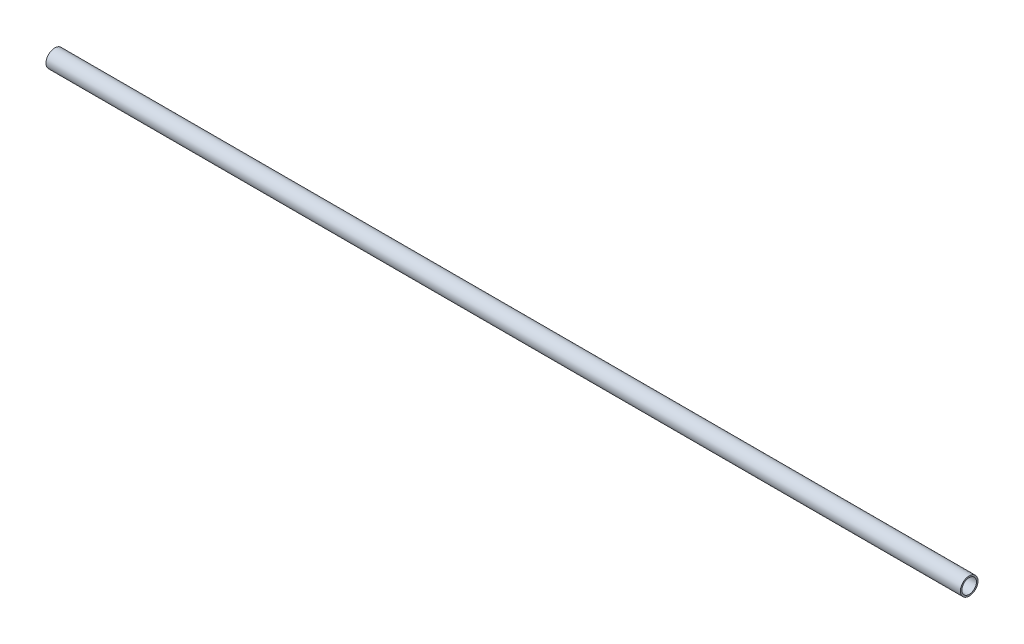
ISO-10303-21;
HEADER;
FILE_DESCRIPTION(('STEP AP214'),'2;1');
FILE_NAME('part.step','',(''),(''),'','','');
FILE_SCHEMA(('AUTOMOTIVE_DESIGN { 1 0 10303 214 1 1 1 1 }'));
ENDSEC;
DATA;
#1=APPLICATION_CONTEXT('core data for automotive mechanical design processes');
#2=APPLICATION_PROTOCOL_DEFINITION('international standard','automotive_design',2000,#1);
#3=PRODUCT_CONTEXT('',#1,'mechanical');
#4=PRODUCT('Part','Part','',(#3));
#5=PRODUCT_RELATED_PRODUCT_CATEGORY('part','',(#4));
#6=PRODUCT_DEFINITION_FORMATION('','',#4);
#7=PRODUCT_DEFINITION_CONTEXT('part definition',#1,'design');
#8=PRODUCT_DEFINITION('design','',#6,#7);
#9=PRODUCT_DEFINITION_SHAPE('','',#8);
#10=(LENGTH_UNIT() NAMED_UNIT(*) SI_UNIT(.MILLI.,.METRE.));
#11=(NAMED_UNIT(*) PLANE_ANGLE_UNIT() SI_UNIT($,.RADIAN.));
#12=(NAMED_UNIT(*) SI_UNIT($,.STERADIAN.) SOLID_ANGLE_UNIT());
#13=UNCERTAINTY_MEASURE_WITH_UNIT(LENGTH_MEASURE(1.E-05),#10,'distance_accuracy_value','');
#14=(GEOMETRIC_REPRESENTATION_CONTEXT(3) GLOBAL_UNCERTAINTY_ASSIGNED_CONTEXT((#13)) GLOBAL_UNIT_ASSIGNED_CONTEXT((#10,
#11,#12)) REPRESENTATION_CONTEXT('',''));
#15=CARTESIAN_POINT('',(0.,0.,0.));
#16=DIRECTION('',(0.,0.,1.));
#17=DIRECTION('',(1.,0.,0.));
#18=AXIS2_PLACEMENT_3D('',#15,#16,#17);
#19=CARTESIAN_POINT('',(495.3,0.,0.));
#20=DIRECTION('',(1.,0.,0.));
#21=DIRECTION('',(0.,0.,-1.));
#22=AXIS2_PLACEMENT_3D('',#19,#20,#21);
#23=PLANE('',#22);
#24=CARTESIAN_POINT('',(495.3,0.,0.));
#25=DIRECTION('',(1.,0.,0.));
#26=DIRECTION('',(0.,0.,-1.));
#27=AXIS2_PLACEMENT_3D('',#24,#25,#26);
#28=CIRCLE('',#27,9.525);
#29=CARTESIAN_POINT('',(495.3,0.,-9.525));
#30=VERTEX_POINT('',#29);
#31=EDGE_CURVE('E10',#30,#30,#28,.T.);
#32=ORIENTED_EDGE('',*,*,#31,.T.);
#33=EDGE_LOOP('',(#32));
#34=FACE_BOUND('',#33,.T.);
#35=CARTESIAN_POINT('',(495.3,0.,0.));
#36=DIRECTION('',(1.,0.,0.));
#37=DIRECTION('',(0.,0.,-1.));
#38=AXIS2_PLACEMENT_3D('',#35,#36,#37);
#39=CIRCLE('',#38,7.874);
#40=CARTESIAN_POINT('',(495.3,0.,-7.874));
#41=VERTEX_POINT('',#40);
#42=EDGE_CURVE('E44',#41,#41,#39,.T.);
#43=ORIENTED_EDGE('',*,*,#42,.F.);
#44=EDGE_LOOP('',(#43));
#45=FACE_BOUND('',#44,.T.);
#46=ADVANCED_FACE('F33',(#34,#45),#23,.T.);
#47=CARTESIAN_POINT('',(-495.3,0.,0.));
#48=DIRECTION('',(1.,0.,0.));
#49=DIRECTION('',(0.,0.,-1.));
#50=AXIS2_PLACEMENT_3D('',#47,#48,#49);
#51=PLANE('',#50);
#52=CARTESIAN_POINT('',(-495.3,0.,0.));
#53=DIRECTION('',(1.,0.,0.));
#54=DIRECTION('',(0.,0.,-1.));
#55=AXIS2_PLACEMENT_3D('',#52,#53,#54);
#56=CIRCLE('',#55,9.525);
#57=CARTESIAN_POINT('',(-495.3,0.,-9.525));
#58=VERTEX_POINT('',#57);
#59=EDGE_CURVE('E37',#58,#58,#56,.T.);
#60=ORIENTED_EDGE('',*,*,#59,.F.);
#61=EDGE_LOOP('',(#60));
#62=FACE_BOUND('',#61,.T.);
#63=CARTESIAN_POINT('',(-495.3,0.,0.));
#64=DIRECTION('',(1.,0.,0.));
#65=DIRECTION('',(0.,0.,-1.));
#66=AXIS2_PLACEMENT_3D('',#63,#64,#65);
#67=CIRCLE('',#66,7.874);
#68=CARTESIAN_POINT('',(-495.3,0.,-7.874));
#69=VERTEX_POINT('',#68);
#70=EDGE_CURVE('E46',#69,#69,#67,.T.);
#71=ORIENTED_EDGE('',*,*,#70,.T.);
#72=EDGE_LOOP('',(#71));
#73=FACE_BOUND('',#72,.T.);
#74=ADVANCED_FACE('F56',(#62,#73),#51,.F.);
#75=CARTESIAN_POINT('',(495.3,0.,0.));
#76=DIRECTION('',(-1.,0.,0.));
#77=DIRECTION('',(0.,0.,1.));
#78=AXIS2_PLACEMENT_3D('',#75,#76,#77);
#79=CYLINDRICAL_SURFACE('',#78,9.525);
#80=ORIENTED_EDGE('',*,*,#31,.F.);
#81=EDGE_LOOP('',(#80));
#82=FACE_BOUND('',#81,.T.);
#83=ORIENTED_EDGE('',*,*,#59,.T.);
#84=EDGE_LOOP('',(#83));
#85=FACE_BOUND('',#84,.T.);
#86=ADVANCED_FACE('F35',(#82,#85),#79,.T.);
#87=CARTESIAN_POINT('',(495.3,0.,0.));
#88=DIRECTION('',(-1.,0.,0.));
#89=DIRECTION('',(0.,0.,1.));
#90=AXIS2_PLACEMENT_3D('',#87,#88,#89);
#91=CYLINDRICAL_SURFACE('',#90,7.874);
#92=ORIENTED_EDGE('',*,*,#42,.T.);
#93=EDGE_LOOP('',(#92));
#94=FACE_BOUND('',#93,.T.);
#95=ORIENTED_EDGE('',*,*,#70,.F.);
#96=EDGE_LOOP('',(#95));
#97=FACE_BOUND('',#96,.T.);
#98=ADVANCED_FACE('F52',(#94,#97),#91,.F.);
#99=CLOSED_SHELL('',(#46,#74,#86,#98));
#100=MANIFOLD_SOLID_BREP('B2',#99);
#101=ADVANCED_BREP_SHAPE_REPRESENTATION('',(#18,#100),#14);
#102=SHAPE_DEFINITION_REPRESENTATION(#9,#101);
ENDSEC;
END-ISO-10303-21;
